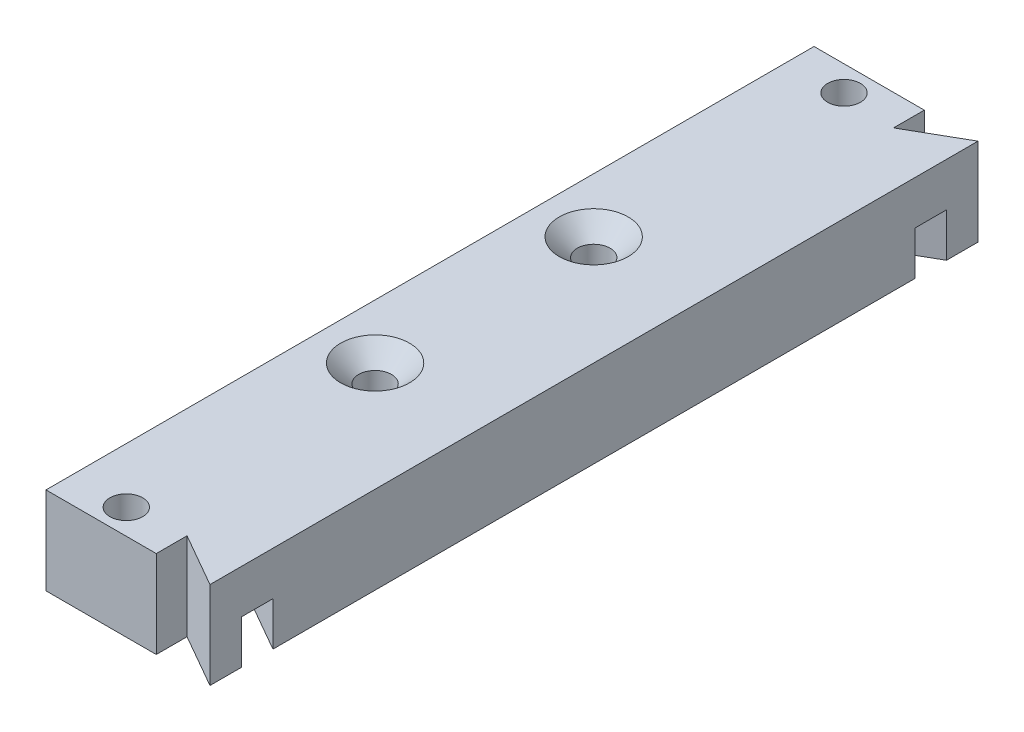
ISO-10303-21;
HEADER;
FILE_DESCRIPTION(('STEP AP214'),'2;1');
FILE_NAME('part.step','',(''),(''),'','','');
FILE_SCHEMA(('AUTOMOTIVE_DESIGN { 1 0 10303 214 1 1 1 1 }'));
ENDSEC;
DATA;
#1=APPLICATION_CONTEXT('core data for automotive mechanical design processes');
#2=APPLICATION_PROTOCOL_DEFINITION('international standard','automotive_design',2000,#1);
#3=PRODUCT_CONTEXT('',#1,'mechanical');
#4=PRODUCT('Part','Part','',(#3));
#5=PRODUCT_RELATED_PRODUCT_CATEGORY('part','',(#4));
#6=PRODUCT_DEFINITION_FORMATION('','',#4);
#7=PRODUCT_DEFINITION_CONTEXT('part definition',#1,'design');
#8=PRODUCT_DEFINITION('design','',#6,#7);
#9=PRODUCT_DEFINITION_SHAPE('','',#8);
#10=(LENGTH_UNIT() NAMED_UNIT(*) SI_UNIT(.MILLI.,.METRE.));
#11=(NAMED_UNIT(*) PLANE_ANGLE_UNIT() SI_UNIT($,.RADIAN.));
#12=(NAMED_UNIT(*) SI_UNIT($,.STERADIAN.) SOLID_ANGLE_UNIT());
#13=UNCERTAINTY_MEASURE_WITH_UNIT(LENGTH_MEASURE(1.E-05),#10,'distance_accuracy_value','');
#14=(GEOMETRIC_REPRESENTATION_CONTEXT(3) GLOBAL_UNCERTAINTY_ASSIGNED_CONTEXT((#13)) GLOBAL_UNIT_ASSIGNED_CONTEXT((#10,
#11,#12)) REPRESENTATION_CONTEXT('',''));
#15=CARTESIAN_POINT('',(0.,0.,0.));
#16=DIRECTION('',(0.,0.,1.));
#17=DIRECTION('',(1.,0.,0.));
#18=AXIS2_PLACEMENT_3D('',#15,#16,#17);
#19=CARTESIAN_POINT('',(0.,8.,0.));
#20=DIRECTION('',(0.,1.,0.));
#21=DIRECTION('',(0.,0.,1.));
#22=AXIS2_PLACEMENT_3D('',#19,#20,#21);
#23=PLANE('',#22);
#24=CARTESIAN_POINT('',(-2.45640421231828,8.,32.8312620118089));
#25=DIRECTION('',(0.,1.,0.));
#26=DIRECTION('',(0.,0.,1.));
#27=AXIS2_PLACEMENT_3D('',#24,#25,#26);
#28=CIRCLE('',#27,1.49999999999999);
#29=CARTESIAN_POINT('',(-2.45640421231828,8.,34.3312620118088));
#30=VERTEX_POINT('',#29);
#31=EDGE_CURVE('E207',#30,#30,#28,.F.);
#32=ORIENTED_EDGE('',*,*,#31,.T.);
#33=EDGE_LOOP('',(#32));
#34=FACE_BOUND('',#33,.T.);
#35=DIRECTION('',(-0.867610112365973,0.,0.497245103465387));
#36=VECTOR('',#35,1.);
#37=CARTESIAN_POINT('',(6.25688724133653,8.,-34.4188086603662));
#38=LINE('',#37,#36);
#39=CARTESIAN_POINT('',(7.5,8.,-35.1312620118089));
#40=VERTEX_POINT('',#39);
#41=CARTESIAN_POINT('',(2.58719157536374,8.,-32.3156310059045));
#42=VERTEX_POINT('',#41);
#43=EDGE_CURVE('E243',#40,#42,#38,.T.);
#44=ORIENTED_EDGE('',*,*,#43,.T.);
#45=DIRECTION('',(0.,0.,-1.));
#46=VECTOR('',#45,1.);
#47=CARTESIAN_POINT('',(2.58719157536374,8.,-29.5));
#48=LINE('',#47,#46);
#49=CARTESIAN_POINT('',(2.58719157536374,8.,-35.1312620118089));
#50=VERTEX_POINT('',#49);
#51=EDGE_CURVE('E210',#42,#50,#48,.T.);
#52=ORIENTED_EDGE('',*,*,#51,.T.);
#53=DIRECTION('',(-1.,0.,0.));
#54=VECTOR('',#53,1.);
#55=CARTESIAN_POINT('',(-7.49999999999998,8.,-35.1312620118089));
#56=LINE('',#55,#54);
#57=CARTESIAN_POINT('',(-7.49999999999998,8.,-35.1312620118089));
#58=VERTEX_POINT('',#57);
#59=EDGE_CURVE('E222',#50,#58,#56,.T.);
#60=ORIENTED_EDGE('',*,*,#59,.T.);
#61=DIRECTION('',(0.,0.,1.));
#62=VECTOR('',#61,1.);
#63=CARTESIAN_POINT('',(-7.5,8.,-24.5));
#64=LINE('',#63,#62);
#65=CARTESIAN_POINT('',(-7.5,8.,35.1312620118089));
#66=VERTEX_POINT('',#65);
#67=EDGE_CURVE('E354',#58,#66,#64,.T.);
#68=ORIENTED_EDGE('',*,*,#67,.T.);
#69=DIRECTION('',(1.,0.,0.));
#70=VECTOR('',#69,1.);
#71=CARTESIAN_POINT('',(-7.5,8.,35.1312620118089));
#72=LINE('',#71,#70);
#73=CARTESIAN_POINT('',(2.58719157536372,8.,35.1312620118089));
#74=VERTEX_POINT('',#73);
#75=EDGE_CURVE('E194',#66,#74,#72,.T.);
#76=ORIENTED_EDGE('',*,*,#75,.T.);
#77=DIRECTION('',(0.,0.,-1.));
#78=VECTOR('',#77,1.);
#79=CARTESIAN_POINT('',(2.58719157536372,8.,29.5));
#80=LINE('',#79,#78);
#81=CARTESIAN_POINT('',(2.58719157536372,8.,32.3156310059045));
#82=VERTEX_POINT('',#81);
#83=EDGE_CURVE('E201',#74,#82,#80,.T.);
#84=ORIENTED_EDGE('',*,*,#83,.T.);
#85=DIRECTION('',(0.867610112365975,0.,0.497245103465384));
#86=VECTOR('',#85,1.);
#87=CARTESIAN_POINT('',(7.5,8.,35.1312620118089));
#88=LINE('',#87,#86);
#89=CARTESIAN_POINT('',(7.5,8.,35.1312620118089));
#90=VERTEX_POINT('',#89);
#91=EDGE_CURVE('E54',#82,#90,#88,.T.);
#92=ORIENTED_EDGE('',*,*,#91,.T.);
#93=DIRECTION('',(0.,0.,-1.));
#94=VECTOR('',#93,1.);
#95=CARTESIAN_POINT('',(7.5,8.,-24.5));
#96=LINE('',#95,#94);
#97=EDGE_CURVE('E352',#90,#40,#96,.T.);
#98=ORIENTED_EDGE('',*,*,#97,.T.);
#99=EDGE_LOOP('',(#44,#52,#60,#68,#76,#84,#92,#98));
#100=FACE_BOUND('',#99,.T.);
#101=CARTESIAN_POINT('',(-2.49999991059316,8.,10.0249999999876));
#102=DIRECTION('',(0.,1.,0.));
#103=DIRECTION('',(0.,0.,1.));
#104=AXIS2_PLACEMENT_3D('',#101,#102,#103);
#105=CIRCLE('',#104,3.15);
#106=CARTESIAN_POINT('',(-2.49999991059316,8.,13.1749999999876));
#107=VERTEX_POINT('',#106);
#108=EDGE_CURVE('E324',#107,#107,#105,.T.);
#109=ORIENTED_EDGE('',*,*,#108,.F.);
#110=EDGE_LOOP('',(#109));
#111=FACE_BOUND('',#110,.T.);
#112=CARTESIAN_POINT('',(-2.49999991059317,8.,-9.97500000001244));
#113=DIRECTION('',(0.,1.,0.));
#114=DIRECTION('',(0.,0.,1.));
#115=AXIS2_PLACEMENT_3D('',#112,#113,#114);
#116=CIRCLE('',#115,3.15);
#117=CARTESIAN_POINT('',(-2.49999991059317,8.,-6.82500000001244));
#118=VERTEX_POINT('',#117);
#119=EDGE_CURVE('E342',#118,#118,#116,.T.);
#120=ORIENTED_EDGE('',*,*,#119,.F.);
#121=EDGE_LOOP('',(#120));
#122=FACE_BOUND('',#121,.T.);
#123=CARTESIAN_POINT('',(-2.45640421231828,8.,-32.8312620118089));
#124=DIRECTION('',(0.,1.,0.));
#125=DIRECTION('',(0.,0.,1.));
#126=AXIS2_PLACEMENT_3D('',#123,#124,#125);
#127=CIRCLE('',#126,1.49999999999999);
#128=CARTESIAN_POINT('',(-2.45640421231828,8.,-31.3312620118089));
#129=VERTEX_POINT('',#128);
#130=EDGE_CURVE('E489',#129,#129,#127,.T.);
#131=ORIENTED_EDGE('',*,*,#130,.F.);
#132=EDGE_LOOP('',(#131));
#133=FACE_BOUND('',#132,.T.);
#134=ADVANCED_FACE('F39',(#34,#100,#111,#122,#133),#23,.T.);
#135=CARTESIAN_POINT('',(-7.5,8.,-24.5));
#136=DIRECTION('',(0.,0.,1.));
#137=DIRECTION('',(1.,0.,0.));
#138=AXIS2_PLACEMENT_3D('',#135,#136,#137);
#139=PLANE('',#138);
#140=DIRECTION('',(1.,0.,0.));
#141=VECTOR('',#140,1.);
#142=CARTESIAN_POINT('',(-0.994383150726536,4.,-24.5));
#143=LINE('',#142,#141);
#144=CARTESIAN_POINT('',(-7.5,4.,-24.5));
#145=VERTEX_POINT('',#144);
#146=CARTESIAN_POINT('',(-0.994383150726536,4.,-24.5));
#147=VERTEX_POINT('',#146);
#148=EDGE_CURVE('E294',#145,#147,#143,.T.);
#149=ORIENTED_EDGE('',*,*,#148,.T.);
#150=DIRECTION('',(0.,1.,0.));
#151=VECTOR('',#150,1.);
#152=CARTESIAN_POINT('',(-0.994383150726536,0.,-24.5));
#153=LINE('',#152,#151);
#154=CARTESIAN_POINT('',(-0.994383150726536,0.,-24.5));
#155=VERTEX_POINT('',#154);
#156=EDGE_CURVE('E327',#155,#147,#153,.T.);
#157=ORIENTED_EDGE('',*,*,#156,.F.);
#158=DIRECTION('',(-1.,0.,0.));
#159=VECTOR('',#158,1.);
#160=CARTESIAN_POINT('',(-7.5,0.,-24.5));
#161=LINE('',#160,#159);
#162=CARTESIAN_POINT('',(-7.5,0.,-24.5));
#163=VERTEX_POINT('',#162);
#164=EDGE_CURVE('E358',#155,#163,#161,.T.);
#165=ORIENTED_EDGE('',*,*,#164,.T.);
#166=DIRECTION('',(0.,-1.,0.));
#167=VECTOR('',#166,1.);
#168=CARTESIAN_POINT('',(-7.5,8.,-24.5));
#169=LINE('',#168,#167);
#170=EDGE_CURVE('E11',#145,#163,#169,.T.);
#171=ORIENTED_EDGE('',*,*,#170,.F.);
#172=EDGE_LOOP('',(#149,#157,#165,#171));
#173=FACE_BOUND('',#172,.T.);
#174=ADVANCED_FACE('F433',(#173),#139,.F.);
#175=CARTESIAN_POINT('',(7.5,0.,-29.3683047470936));
#176=DIRECTION('',(-0.497245103465387,0.,-0.867610112365973));
#177=DIRECTION('',(-0.867610112365973,0.,0.497245103465387));
#178=AXIS2_PLACEMENT_3D('',#175,#176,#177);
#179=PLANE('',#178);
#180=ORIENTED_EDGE('',*,*,#156,.T.);
#181=DIRECTION('',(0.867610112365973,0.,-0.497245103465387));
#182=VECTOR('',#181,1.);
#183=CARTESIAN_POINT('',(7.5,4.,-29.3683047470936));
#184=LINE('',#183,#182);
#185=CARTESIAN_POINT('',(7.5,4.,-29.3683047470936));
#186=VERTEX_POINT('',#185);
#187=EDGE_CURVE('E297',#147,#186,#184,.T.);
#188=ORIENTED_EDGE('',*,*,#187,.T.);
#189=DIRECTION('',(0.,1.,0.));
#190=VECTOR('',#189,1.);
#191=CARTESIAN_POINT('',(7.5,0.,-29.3683047470936));
#192=LINE('',#191,#190);
#193=CARTESIAN_POINT('',(7.5,0.,-29.3683047470936));
#194=VERTEX_POINT('',#193);
#195=EDGE_CURVE('E300',#194,#186,#192,.T.);
#196=ORIENTED_EDGE('',*,*,#195,.F.);
#197=DIRECTION('',(-0.867610112365973,0.,0.497245103465387));
#198=VECTOR('',#197,1.);
#199=CARTESIAN_POINT('',(7.5,0.,-29.3683047470936));
#200=LINE('',#199,#198);
#201=EDGE_CURVE('E320',#194,#155,#200,.T.);
#202=ORIENTED_EDGE('',*,*,#201,.T.);
#203=EDGE_LOOP('',(#180,#188,#196,#202));
#204=FACE_BOUND('',#203,.T.);
#205=ADVANCED_FACE('F440',(#204),#179,.T.);
#206=CARTESIAN_POINT('',(7.5,8.,-24.5));
#207=DIRECTION('',(-1.,0.,0.));
#208=DIRECTION('',(0.,0.,1.));
#209=AXIS2_PLACEMENT_3D('',#206,#207,#208);
#210=PLANE('',#209);
#211=DIRECTION('',(0.,0.,-1.));
#212=VECTOR('',#211,1.);
#213=CARTESIAN_POINT('',(7.5,0.,-24.5));
#214=LINE('',#213,#212);
#215=CARTESIAN_POINT('',(7.5,0.,29.3683047470936));
#216=VERTEX_POINT('',#215);
#217=EDGE_CURVE('E351',#216,#194,#214,.T.);
#218=ORIENTED_EDGE('',*,*,#217,.T.);
#219=ORIENTED_EDGE('',*,*,#195,.T.);
#220=DIRECTION('',(0.,0.,-1.));
#221=VECTOR('',#220,1.);
#222=CARTESIAN_POINT('',(7.5,4.,-29.3683047470936));
#223=LINE('',#222,#221);
#224=CARTESIAN_POINT('',(7.5,4.,-32.2497833794513));
#225=VERTEX_POINT('',#224);
#226=EDGE_CURVE('E281',#186,#225,#223,.T.);
#227=ORIENTED_EDGE('',*,*,#226,.T.);
#228=DIRECTION('',(0.,1.,0.));
#229=VECTOR('',#228,1.);
#230=CARTESIAN_POINT('',(7.5,0.,-32.2497833794513));
#231=LINE('',#230,#229);
#232=CARTESIAN_POINT('',(7.5,0.,-32.2497833794513));
#233=VERTEX_POINT('',#232);
#234=EDGE_CURVE('E233',#233,#225,#231,.T.);
#235=ORIENTED_EDGE('',*,*,#234,.F.);
#236=DIRECTION('',(0.,0.,-1.));
#237=VECTOR('',#236,1.);
#238=CARTESIAN_POINT('',(7.5,0.,-32.2497833794513));
#239=LINE('',#238,#237);
#240=CARTESIAN_POINT('',(7.5,0.,-35.1312620118089));
#241=VERTEX_POINT('',#240);
#242=EDGE_CURVE('E268',#233,#241,#239,.T.);
#243=ORIENTED_EDGE('',*,*,#242,.T.);
#244=DIRECTION('',(0.,1.,0.));
#245=VECTOR('',#244,1.);
#246=CARTESIAN_POINT('',(7.5,0.,-35.1312620118089));
#247=LINE('',#246,#245);
#248=EDGE_CURVE('E254',#241,#40,#247,.T.);
#249=ORIENTED_EDGE('',*,*,#248,.T.);
#250=ORIENTED_EDGE('',*,*,#97,.F.);
#251=DIRECTION('',(0.,1.,0.));
#252=VECTOR('',#251,1.);
#253=CARTESIAN_POINT('',(7.5,0.,35.1312620118089));
#254=LINE('',#253,#252);
#255=CARTESIAN_POINT('',(7.5,0.,35.1312620118089));
#256=VERTEX_POINT('',#255);
#257=EDGE_CURVE('E251',#256,#90,#254,.T.);
#258=ORIENTED_EDGE('',*,*,#257,.F.);
#259=DIRECTION('',(0.,0.,-1.));
#260=VECTOR('',#259,1.);
#261=CARTESIAN_POINT('',(7.5,0.,32.2497833794513));
#262=LINE('',#261,#260);
#263=CARTESIAN_POINT('',(7.5,0.,32.2497833794513));
#264=VERTEX_POINT('',#263);
#265=EDGE_CURVE('E236',#256,#264,#262,.T.);
#266=ORIENTED_EDGE('',*,*,#265,.T.);
#267=DIRECTION('',(0.,1.,0.));
#268=VECTOR('',#267,1.);
#269=CARTESIAN_POINT('',(7.5,0.,32.2497833794513));
#270=LINE('',#269,#268);
#271=CARTESIAN_POINT('',(7.5,4.,32.2497833794513));
#272=VERTEX_POINT('',#271);
#273=EDGE_CURVE('E248',#264,#272,#270,.T.);
#274=ORIENTED_EDGE('',*,*,#273,.T.);
#275=DIRECTION('',(0.,0.,-1.));
#276=VECTOR('',#275,1.);
#277=CARTESIAN_POINT('',(7.5,4.,29.3683047470936));
#278=LINE('',#277,#276);
#279=CARTESIAN_POINT('',(7.5,4.,29.3683047470936));
#280=VERTEX_POINT('',#279);
#281=EDGE_CURVE('E306',#272,#280,#278,.T.);
#282=ORIENTED_EDGE('',*,*,#281,.T.);
#283=DIRECTION('',(0.,1.,0.));
#284=VECTOR('',#283,1.);
#285=CARTESIAN_POINT('',(7.5,0.,29.3683047470936));
#286=LINE('',#285,#284);
#287=EDGE_CURVE('E321',#216,#280,#286,.T.);
#288=ORIENTED_EDGE('',*,*,#287,.F.);
#289=EDGE_LOOP('',(#218,#219,#227,#235,#243,#249,#250,#258,#266,#274,#282,#288));
#290=FACE_BOUND('',#289,.T.);
#291=ADVANCED_FACE('F41',(#290),#210,.F.);
#292=CARTESIAN_POINT('',(-7.5,8.,-24.5));
#293=DIRECTION('',(1.,0.,0.));
#294=DIRECTION('',(0.,0.,-1.));
#295=AXIS2_PLACEMENT_3D('',#292,#293,#294);
#296=PLANE('',#295);
#297=DIRECTION('',(0.,0.,1.));
#298=VECTOR('',#297,1.);
#299=CARTESIAN_POINT('',(-7.5,0.,-24.5));
#300=LINE('',#299,#298);
#301=CARTESIAN_POINT('',(-7.5,0.,24.5));
#302=VERTEX_POINT('',#301);
#303=EDGE_CURVE('E361',#163,#302,#300,.T.);
#304=ORIENTED_EDGE('',*,*,#303,.T.);
#305=DIRECTION('',(0.,-1.,0.));
#306=VECTOR('',#305,1.);
#307=CARTESIAN_POINT('',(-7.5,8.,24.5));
#308=LINE('',#307,#306);
#309=CARTESIAN_POINT('',(-7.5,4.,24.5));
#310=VERTEX_POINT('',#309);
#311=EDGE_CURVE('E47',#310,#302,#308,.T.);
#312=ORIENTED_EDGE('',*,*,#311,.F.);
#313=DIRECTION('',(0.,0.,1.));
#314=VECTOR('',#313,1.);
#315=CARTESIAN_POINT('',(-7.5,4.,27.));
#316=LINE('',#315,#314);
#317=CARTESIAN_POINT('',(-7.5,4.,27.));
#318=VERTEX_POINT('',#317);
#319=EDGE_CURVE('E285',#310,#318,#316,.T.);
#320=ORIENTED_EDGE('',*,*,#319,.T.);
#321=DIRECTION('',(0.,1.,0.));
#322=VECTOR('',#321,1.);
#323=CARTESIAN_POINT('',(-7.5,0.,27.));
#324=LINE('',#323,#322);
#325=CARTESIAN_POINT('',(-7.5,0.,27.));
#326=VERTEX_POINT('',#325);
#327=EDGE_CURVE('E181',#326,#318,#324,.T.);
#328=ORIENTED_EDGE('',*,*,#327,.F.);
#329=DIRECTION('',(0.,0.,1.));
#330=VECTOR('',#329,1.);
#331=CARTESIAN_POINT('',(-7.5,0.,27.));
#332=LINE('',#331,#330);
#333=CARTESIAN_POINT('',(-7.5,0.,35.1312620118089));
#334=VERTEX_POINT('',#333);
#335=EDGE_CURVE('E173',#326,#334,#332,.T.);
#336=ORIENTED_EDGE('',*,*,#335,.T.);
#337=DIRECTION('',(0.,1.,0.));
#338=VECTOR('',#337,1.);
#339=CARTESIAN_POINT('',(-7.5,0.,35.1312620118089));
#340=LINE('',#339,#338);
#341=EDGE_CURVE('E177',#334,#66,#340,.T.);
#342=ORIENTED_EDGE('',*,*,#341,.T.);
#343=ORIENTED_EDGE('',*,*,#67,.F.);
#344=DIRECTION('',(0.,1.,0.));
#345=VECTOR('',#344,1.);
#346=CARTESIAN_POINT('',(-7.49999999999998,0.,-35.1312620118089));
#347=LINE('',#346,#345);
#348=CARTESIAN_POINT('',(-7.49999999999998,0.,-35.1312620118089));
#349=VERTEX_POINT('',#348);
#350=EDGE_CURVE('E218',#349,#58,#347,.T.);
#351=ORIENTED_EDGE('',*,*,#350,.F.);
#352=DIRECTION('',(0.,0.,1.));
#353=VECTOR('',#352,1.);
#354=CARTESIAN_POINT('',(-7.5,0.,-29.5));
#355=LINE('',#354,#353);
#356=CARTESIAN_POINT('',(-7.5,0.,-27.));
#357=VERTEX_POINT('',#356);
#358=EDGE_CURVE('E274',#349,#357,#355,.T.);
#359=ORIENTED_EDGE('',*,*,#358,.T.);
#360=DIRECTION('',(0.,1.,0.));
#361=VECTOR('',#360,1.);
#362=CARTESIAN_POINT('',(-7.5,0.,-27.));
#363=LINE('',#362,#361);
#364=CARTESIAN_POINT('',(-7.5,4.,-27.));
#365=VERTEX_POINT('',#364);
#366=EDGE_CURVE('E258',#357,#365,#363,.T.);
#367=ORIENTED_EDGE('',*,*,#366,.T.);
#368=DIRECTION('',(0.,0.,1.));
#369=VECTOR('',#368,1.);
#370=CARTESIAN_POINT('',(-7.5,4.,-24.5));
#371=LINE('',#370,#369);
#372=EDGE_CURVE('E291',#365,#145,#371,.T.);
#373=ORIENTED_EDGE('',*,*,#372,.T.);
#374=ORIENTED_EDGE('',*,*,#170,.T.);
#375=EDGE_LOOP('',(#304,#312,#320,#328,#336,#342,#343,#351,#359,#367,#373,#374));
#376=FACE_BOUND('',#375,.T.);
#377=ADVANCED_FACE('F176',(#376),#296,.F.);
#378=CARTESIAN_POINT('',(-7.5,8.,24.5));
#379=DIRECTION('',(0.,0.,-1.));
#380=DIRECTION('',(-1.,0.,0.));
#381=AXIS2_PLACEMENT_3D('',#378,#379,#380);
#382=PLANE('',#381);
#383=DIRECTION('',(0.,1.,0.));
#384=VECTOR('',#383,1.);
#385=CARTESIAN_POINT('',(-0.994383150726525,0.,24.5));
#386=LINE('',#385,#384);
#387=CARTESIAN_POINT('',(-0.994383150726525,0.,24.5));
#388=VERTEX_POINT('',#387);
#389=CARTESIAN_POINT('',(-0.994383150726525,4.,24.5));
#390=VERTEX_POINT('',#389);
#391=EDGE_CURVE('E319',#388,#390,#386,.T.);
#392=ORIENTED_EDGE('',*,*,#391,.T.);
#393=DIRECTION('',(-1.,0.,0.));
#394=VECTOR('',#393,1.);
#395=CARTESIAN_POINT('',(-7.5,4.,24.5));
#396=LINE('',#395,#394);
#397=EDGE_CURVE('E247',#390,#310,#396,.T.);
#398=ORIENTED_EDGE('',*,*,#397,.T.);
#399=ORIENTED_EDGE('',*,*,#311,.T.);
#400=DIRECTION('',(1.,0.,0.));
#401=VECTOR('',#400,1.);
#402=CARTESIAN_POINT('',(-7.5,0.,24.5));
#403=LINE('',#402,#401);
#404=EDGE_CURVE('E355',#302,#388,#403,.T.);
#405=ORIENTED_EDGE('',*,*,#404,.T.);
#406=EDGE_LOOP('',(#392,#398,#399,#405));
#407=FACE_BOUND('',#406,.T.);
#408=ADVANCED_FACE('F366',(#407),#382,.F.);
#409=CARTESIAN_POINT('',(0.,0.,0.));
#410=DIRECTION('',(0.,1.,0.));
#411=DIRECTION('',(0.,0.,1.));
#412=AXIS2_PLACEMENT_3D('',#409,#410,#411);
#413=PLANE('',#412);
#414=CARTESIAN_POINT('',(-2.49999991059316,0.,10.0249999999876));
#415=DIRECTION('',(0.,1.,0.));
#416=DIRECTION('',(0.,0.,1.));
#417=AXIS2_PLACEMENT_3D('',#414,#415,#416);
#418=CIRCLE('',#417,1.5);
#419=CARTESIAN_POINT('',(-2.49999991059316,0.,11.5249999999876));
#420=VERTEX_POINT('',#419);
#421=EDGE_CURVE('E339',#420,#420,#418,.T.);
#422=ORIENTED_EDGE('',*,*,#421,.T.);
#423=EDGE_LOOP('',(#422));
#424=FACE_BOUND('',#423,.T.);
#425=CARTESIAN_POINT('',(-2.49999991059317,0.,-9.97500000001244));
#426=DIRECTION('',(0.,1.,0.));
#427=DIRECTION('',(0.,0.,1.));
#428=AXIS2_PLACEMENT_3D('',#425,#426,#427);
#429=CIRCLE('',#428,1.5);
#430=CARTESIAN_POINT('',(-2.49999991059317,0.,-8.47500000001245));
#431=VERTEX_POINT('',#430);
#432=EDGE_CURVE('E348',#431,#431,#429,.T.);
#433=ORIENTED_EDGE('',*,*,#432,.T.);
#434=EDGE_LOOP('',(#433));
#435=FACE_BOUND('',#434,.T.);
#436=ORIENTED_EDGE('',*,*,#217,.F.);
#437=DIRECTION('',(0.867610112365973,0.,0.497245103465387));
#438=VECTOR('',#437,1.);
#439=CARTESIAN_POINT('',(-0.994383150726525,0.,24.5));
#440=LINE('',#439,#438);
#441=EDGE_CURVE('E316',#388,#216,#440,.T.);
#442=ORIENTED_EDGE('',*,*,#441,.F.);
#443=ORIENTED_EDGE('',*,*,#404,.F.);
#444=ORIENTED_EDGE('',*,*,#303,.F.);
#445=ORIENTED_EDGE('',*,*,#164,.F.);
#446=ORIENTED_EDGE('',*,*,#201,.F.);
#447=EDGE_LOOP('',(#436,#442,#443,#444,#445,#446));
#448=FACE_BOUND('',#447,.T.);
#449=ADVANCED_FACE('F373',(#424,#435,#448),#413,.F.);
#450=CARTESIAN_POINT('',(-2.49999991059317,8.,-9.97500000001244));
#451=DIRECTION('',(0.,1.,0.));
#452=DIRECTION('',(0.,0.,1.));
#453=AXIS2_PLACEMENT_3D('',#450,#451,#452);
#454=CYLINDRICAL_SURFACE('',#453,1.5);
#455=ORIENTED_EDGE('',*,*,#432,.F.);
#456=EDGE_LOOP('',(#455));
#457=FACE_BOUND('',#456,.T.);
#458=CARTESIAN_POINT('',(-2.49999991059317,6.35,-9.97500000001244));
#459=DIRECTION('',(0.,1.,0.));
#460=DIRECTION('',(0.,0.,1.));
#461=AXIS2_PLACEMENT_3D('',#458,#459,#460);
#462=CIRCLE('',#461,1.5);
#463=CARTESIAN_POINT('',(-2.49999991059317,6.35,-8.47500000001245));
#464=VERTEX_POINT('',#463);
#465=EDGE_CURVE('E345',#464,#464,#462,.T.);
#466=ORIENTED_EDGE('',*,*,#465,.T.);
#467=EDGE_LOOP('',(#466));
#468=FACE_BOUND('',#467,.T.);
#469=ADVANCED_FACE('F445',(#457,#468),#454,.F.);
#470=CARTESIAN_POINT('',(-2.49999991059317,8.,-9.97500000001244));
#471=DIRECTION('',(0.,1.,0.));
#472=DIRECTION('',(0.,0.,1.));
#473=AXIS2_PLACEMENT_3D('',#470,#471,#472);
#474=CONICAL_SURFACE('',#473,3.15,0.785398163397449);
#475=ORIENTED_EDGE('',*,*,#465,.F.);
#476=EDGE_LOOP('',(#475));
#477=FACE_BOUND('',#476,.T.);
#478=ORIENTED_EDGE('',*,*,#119,.T.);
#479=EDGE_LOOP('',(#478));
#480=FACE_BOUND('',#479,.T.);
#481=ADVANCED_FACE('F474',(#477,#480),#474,.F.);
#482=CARTESIAN_POINT('',(-2.49999991059316,8.,10.0249999999876));
#483=DIRECTION('',(0.,1.,0.));
#484=DIRECTION('',(0.,0.,1.));
#485=AXIS2_PLACEMENT_3D('',#482,#483,#484);
#486=CYLINDRICAL_SURFACE('',#485,1.5);
#487=ORIENTED_EDGE('',*,*,#421,.F.);
#488=EDGE_LOOP('',(#487));
#489=FACE_BOUND('',#488,.T.);
#490=CARTESIAN_POINT('',(-2.49999991059316,6.35,10.0249999999876));
#491=DIRECTION('',(0.,1.,0.));
#492=DIRECTION('',(0.,0.,1.));
#493=AXIS2_PLACEMENT_3D('',#490,#491,#492);
#494=CIRCLE('',#493,1.5);
#495=CARTESIAN_POINT('',(-2.49999991059316,6.35,11.5249999999876));
#496=VERTEX_POINT('',#495);
#497=EDGE_CURVE('E336',#496,#496,#494,.T.);
#498=ORIENTED_EDGE('',*,*,#497,.T.);
#499=EDGE_LOOP('',(#498));
#500=FACE_BOUND('',#499,.T.);
#501=ADVANCED_FACE('F471',(#489,#500),#486,.F.);
#502=CARTESIAN_POINT('',(-2.49999991059316,8.,10.0249999999876));
#503=DIRECTION('',(0.,1.,0.));
#504=DIRECTION('',(0.,0.,1.));
#505=AXIS2_PLACEMENT_3D('',#502,#503,#504);
#506=CONICAL_SURFACE('',#505,3.15,0.785398163397449);
#507=ORIENTED_EDGE('',*,*,#497,.F.);
#508=EDGE_LOOP('',(#507));
#509=FACE_BOUND('',#508,.T.);
#510=ORIENTED_EDGE('',*,*,#108,.T.);
#511=EDGE_LOOP('',(#510));
#512=FACE_BOUND('',#511,.T.);
#513=ADVANCED_FACE('F468',(#509,#512),#506,.F.);
#514=CARTESIAN_POINT('',(-0.994383150726525,0.,24.5));
#515=DIRECTION('',(-0.497245103465387,0.,0.867610112365973));
#516=DIRECTION('',(0.867610112365973,0.,0.497245103465387));
#517=AXIS2_PLACEMENT_3D('',#514,#515,#516);
#518=PLANE('',#517);
#519=DIRECTION('',(-0.867610112365973,0.,-0.497245103465387));
#520=VECTOR('',#519,1.);
#521=CARTESIAN_POINT('',(-0.994383150726525,4.,24.5));
#522=LINE('',#521,#520);
#523=EDGE_CURVE('E303',#280,#390,#522,.T.);
#524=ORIENTED_EDGE('',*,*,#523,.T.);
#525=ORIENTED_EDGE('',*,*,#391,.F.);
#526=ORIENTED_EDGE('',*,*,#441,.T.);
#527=ORIENTED_EDGE('',*,*,#287,.T.);
#528=EDGE_LOOP('',(#524,#525,#526,#527));
#529=FACE_BOUND('',#528,.T.);
#530=ADVANCED_FACE('F377',(#529),#518,.T.);
#531=CARTESIAN_POINT('',(0.,4.,0.));
#532=DIRECTION('',(0.,1.,0.));
#533=DIRECTION('',(0.,0.,1.));
#534=AXIS2_PLACEMENT_3D('',#531,#532,#533);
#535=PLANE('',#534);
#536=ORIENTED_EDGE('',*,*,#226,.F.);
#537=ORIENTED_EDGE('',*,*,#187,.F.);
#538=ORIENTED_EDGE('',*,*,#148,.F.);
#539=ORIENTED_EDGE('',*,*,#372,.F.);
#540=DIRECTION('',(-1.,0.,0.));
#541=VECTOR('',#540,1.);
#542=CARTESIAN_POINT('',(-1.65999999999956,4.,-27.));
#543=LINE('',#542,#541);
#544=CARTESIAN_POINT('',(-1.65999999999956,4.,-27.));
#545=VERTEX_POINT('',#544);
#546=EDGE_CURVE('E288',#545,#365,#543,.T.);
#547=ORIENTED_EDGE('',*,*,#546,.F.);
#548=DIRECTION('',(-0.867610112365972,0.,0.497245103465388));
#549=VECTOR('',#548,1.);
#550=CARTESIAN_POINT('',(7.5,4.,-32.2497833794513));
#551=LINE('',#550,#549);
#552=EDGE_CURVE('E284',#225,#545,#551,.T.);
#553=ORIENTED_EDGE('',*,*,#552,.F.);
#554=EDGE_LOOP('',(#536,#537,#538,#539,#547,#553));
#555=FACE_BOUND('',#554,.T.);
#556=ADVANCED_FACE('F408',(#555),#535,.F.);
#557=CARTESIAN_POINT('',(0.,4.,0.));
#558=DIRECTION('',(0.,-1.,0.));
#559=DIRECTION('',(0.,0.,-1.));
#560=AXIS2_PLACEMENT_3D('',#557,#558,#559);
#561=PLANE('',#560);
#562=ORIENTED_EDGE('',*,*,#319,.F.);
#563=ORIENTED_EDGE('',*,*,#397,.F.);
#564=ORIENTED_EDGE('',*,*,#523,.F.);
#565=ORIENTED_EDGE('',*,*,#281,.F.);
#566=DIRECTION('',(0.867610112365973,0.,0.497245103465387));
#567=VECTOR('',#566,1.);
#568=CARTESIAN_POINT('',(-1.65999999999954,4.,27.));
#569=LINE('',#568,#567);
#570=CARTESIAN_POINT('',(-1.65999999999954,4.,27.));
#571=VERTEX_POINT('',#570);
#572=EDGE_CURVE('E309',#571,#272,#569,.T.);
#573=ORIENTED_EDGE('',*,*,#572,.F.);
#574=DIRECTION('',(1.,0.,0.));
#575=VECTOR('',#574,1.);
#576=CARTESIAN_POINT('',(-7.5,4.,27.));
#577=LINE('',#576,#575);
#578=EDGE_CURVE('E312',#318,#571,#577,.T.);
#579=ORIENTED_EDGE('',*,*,#578,.F.);
#580=EDGE_LOOP('',(#562,#563,#564,#565,#573,#579));
#581=FACE_BOUND('',#580,.T.);
#582=ADVANCED_FACE('F379',(#581),#561,.T.);
#583=CARTESIAN_POINT('',(-7.5,0.,27.));
#584=DIRECTION('',(0.,0.,-1.));
#585=DIRECTION('',(-1.,0.,0.));
#586=AXIS2_PLACEMENT_3D('',#583,#584,#585);
#587=PLANE('',#586);
#588=ORIENTED_EDGE('',*,*,#327,.T.);
#589=ORIENTED_EDGE('',*,*,#578,.T.);
#590=DIRECTION('',(0.,1.,0.));
#591=VECTOR('',#590,1.);
#592=CARTESIAN_POINT('',(-1.65999999999954,0.,27.));
#593=LINE('',#592,#591);
#594=CARTESIAN_POINT('',(-1.65999999999954,0.,27.));
#595=VERTEX_POINT('',#594);
#596=EDGE_CURVE('E244',#595,#571,#593,.T.);
#597=ORIENTED_EDGE('',*,*,#596,.F.);
#598=DIRECTION('',(-1.,0.,0.));
#599=VECTOR('',#598,1.);
#600=CARTESIAN_POINT('',(-7.5,0.,27.));
#601=LINE('',#600,#599);
#602=EDGE_CURVE('E187',#595,#326,#601,.T.);
#603=ORIENTED_EDGE('',*,*,#602,.T.);
#604=EDGE_LOOP('',(#588,#589,#597,#603));
#605=FACE_BOUND('',#604,.T.);
#606=ADVANCED_FACE('F387',(#605),#587,.T.);
#607=CARTESIAN_POINT('',(-1.65999999999954,0.,27.));
#608=DIRECTION('',(0.497245103465387,0.,-0.867610112365973));
#609=DIRECTION('',(-0.867610112365973,0.,-0.497245103465387));
#610=AXIS2_PLACEMENT_3D('',#607,#608,#609);
#611=PLANE('',#610);
#612=ORIENTED_EDGE('',*,*,#596,.T.);
#613=ORIENTED_EDGE('',*,*,#572,.T.);
#614=ORIENTED_EDGE('',*,*,#273,.F.);
#615=DIRECTION('',(-0.867610112365973,0.,-0.497245103465387));
#616=VECTOR('',#615,1.);
#617=CARTESIAN_POINT('',(-1.65999999999954,0.,27.));
#618=LINE('',#617,#616);
#619=EDGE_CURVE('E239',#264,#595,#618,.T.);
#620=ORIENTED_EDGE('',*,*,#619,.T.);
#621=EDGE_LOOP('',(#612,#613,#614,#620));
#622=FACE_BOUND('',#621,.T.);
#623=ADVANCED_FACE('F385',(#622),#611,.T.);
#624=CARTESIAN_POINT('',(7.5,0.,35.1312620118089));
#625=DIRECTION('',(-0.497245103465384,0.,0.867610112365975));
#626=DIRECTION('',(0.867610112365975,0.,0.497245103465384));
#627=AXIS2_PLACEMENT_3D('',#624,#625,#626);
#628=PLANE('',#627);
#629=DIRECTION('',(0.,1.,0.));
#630=VECTOR('',#629,1.);
#631=CARTESIAN_POINT('',(2.58719157536372,0.,32.3156310059045));
#632=LINE('',#631,#630);
#633=CARTESIAN_POINT('',(2.58719157536372,0.,32.3156310059045));
#634=VERTEX_POINT('',#633);
#635=EDGE_CURVE('E58',#634,#82,#632,.T.);
#636=ORIENTED_EDGE('',*,*,#635,.F.);
#637=DIRECTION('',(0.867610112365973,0.,0.497245103465387));
#638=VECTOR('',#637,1.);
#639=CARTESIAN_POINT('',(-2.32561684927256,0.,29.5));
#640=LINE('',#639,#638);
#641=EDGE_CURVE('E186',#634,#256,#640,.T.);
#642=ORIENTED_EDGE('',*,*,#641,.T.);
#643=ORIENTED_EDGE('',*,*,#257,.T.);
#644=ORIENTED_EDGE('',*,*,#91,.F.);
#645=EDGE_LOOP('',(#636,#642,#643,#644));
#646=FACE_BOUND('',#645,.T.);
#647=ADVANCED_FACE('F419',(#646),#628,.T.);
#648=CARTESIAN_POINT('',(0.,0.,0.));
#649=DIRECTION('',(0.,-1.,0.));
#650=DIRECTION('',(0.,0.,-1.));
#651=AXIS2_PLACEMENT_3D('',#648,#649,#650);
#652=PLANE('',#651);
#653=CARTESIAN_POINT('',(-2.45640421231828,0.,32.8312620118089));
#654=DIRECTION('',(0.,1.,0.));
#655=DIRECTION('',(0.,0.,1.));
#656=AXIS2_PLACEMENT_3D('',#653,#654,#655);
#657=CIRCLE('',#656,1.49999999999999);
#658=CARTESIAN_POINT('',(-2.45640421231828,0.,34.3312620118088));
#659=VERTEX_POINT('',#658);
#660=EDGE_CURVE('E491',#659,#659,#657,.F.);
#661=ORIENTED_EDGE('',*,*,#660,.F.);
#662=EDGE_LOOP('',(#661));
#663=FACE_BOUND('',#662,.T.);
#664=ORIENTED_EDGE('',*,*,#641,.F.);
#665=DIRECTION('',(0.,0.,-1.));
#666=VECTOR('',#665,1.);
#667=CARTESIAN_POINT('',(2.58719157536372,0.,29.5));
#668=LINE('',#667,#666);
#669=CARTESIAN_POINT('',(2.58719157536372,0.,35.1312620118089));
#670=VERTEX_POINT('',#669);
#671=EDGE_CURVE('E196',#670,#634,#668,.T.);
#672=ORIENTED_EDGE('',*,*,#671,.F.);
#673=DIRECTION('',(1.,0.,0.));
#674=VECTOR('',#673,1.);
#675=CARTESIAN_POINT('',(-7.5,0.,35.1312620118089));
#676=LINE('',#675,#674);
#677=EDGE_CURVE('E192',#334,#670,#676,.T.);
#678=ORIENTED_EDGE('',*,*,#677,.F.);
#679=ORIENTED_EDGE('',*,*,#335,.F.);
#680=ORIENTED_EDGE('',*,*,#602,.F.);
#681=ORIENTED_EDGE('',*,*,#619,.F.);
#682=ORIENTED_EDGE('',*,*,#265,.F.);
#683=EDGE_LOOP('',(#664,#672,#678,#679,#680,#681,#682));
#684=FACE_BOUND('',#683,.T.);
#685=ADVANCED_FACE('F199',(#663,#684),#652,.T.);
#686=CARTESIAN_POINT('',(7.5,0.,-32.2497833794513));
#687=DIRECTION('',(0.497245103465387,0.,0.867610112365973));
#688=DIRECTION('',(0.867610112365973,0.,-0.497245103465387));
#689=AXIS2_PLACEMENT_3D('',#686,#687,#688);
#690=PLANE('',#689);
#691=ORIENTED_EDGE('',*,*,#552,.T.);
#692=DIRECTION('',(0.,1.,0.));
#693=VECTOR('',#692,1.);
#694=CARTESIAN_POINT('',(-1.65999999999956,0.,-27.));
#695=LINE('',#694,#693);
#696=CARTESIAN_POINT('',(-1.65999999999956,0.,-27.));
#697=VERTEX_POINT('',#696);
#698=EDGE_CURVE('E261',#697,#545,#695,.T.);
#699=ORIENTED_EDGE('',*,*,#698,.F.);
#700=DIRECTION('',(0.867610112365973,0.,-0.497245103465387));
#701=VECTOR('',#700,1.);
#702=CARTESIAN_POINT('',(7.5,0.,-32.2497833794513));
#703=LINE('',#702,#701);
#704=EDGE_CURVE('E257',#697,#233,#703,.T.);
#705=ORIENTED_EDGE('',*,*,#704,.T.);
#706=ORIENTED_EDGE('',*,*,#234,.T.);
#707=EDGE_LOOP('',(#691,#699,#705,#706));
#708=FACE_BOUND('',#707,.T.);
#709=ADVANCED_FACE('F410',(#708),#690,.T.);
#710=CARTESIAN_POINT('',(-1.65999999999956,0.,-27.));
#711=DIRECTION('',(0.,0.,1.));
#712=DIRECTION('',(1.,0.,0.));
#713=AXIS2_PLACEMENT_3D('',#710,#711,#712);
#714=PLANE('',#713);
#715=ORIENTED_EDGE('',*,*,#546,.T.);
#716=ORIENTED_EDGE('',*,*,#366,.F.);
#717=DIRECTION('',(1.,0.,0.));
#718=VECTOR('',#717,1.);
#719=CARTESIAN_POINT('',(-1.65999999999956,0.,-27.));
#720=LINE('',#719,#718);
#721=EDGE_CURVE('E271',#357,#697,#720,.T.);
#722=ORIENTED_EDGE('',*,*,#721,.T.);
#723=ORIENTED_EDGE('',*,*,#698,.T.);
#724=EDGE_LOOP('',(#715,#716,#722,#723));
#725=FACE_BOUND('',#724,.T.);
#726=ADVANCED_FACE('F406',(#725),#714,.T.);
#727=CARTESIAN_POINT('',(6.25688724133653,0.,-34.4188086603662));
#728=DIRECTION('',(-0.497245103465387,0.,-0.867610112365973));
#729=DIRECTION('',(-0.867610112365973,0.,0.497245103465387));
#730=AXIS2_PLACEMENT_3D('',#727,#728,#729);
#731=PLANE('',#730);
#732=DIRECTION('',(0.,-1.,0.));
#733=VECTOR('',#732,1.);
#734=CARTESIAN_POINT('',(2.58719157536374,0.,-32.3156310059045));
#735=LINE('',#734,#733);
#736=CARTESIAN_POINT('',(2.58719157536373,0.,-32.3156310059045));
#737=VERTEX_POINT('',#736);
#738=EDGE_CURVE('E212',#42,#737,#735,.T.);
#739=ORIENTED_EDGE('',*,*,#738,.F.);
#740=ORIENTED_EDGE('',*,*,#43,.F.);
#741=ORIENTED_EDGE('',*,*,#248,.F.);
#742=DIRECTION('',(-0.867610112365973,0.,0.497245103465388));
#743=VECTOR('',#742,1.);
#744=CARTESIAN_POINT('',(7.5,0.,-35.1312620118089));
#745=LINE('',#744,#743);
#746=EDGE_CURVE('E277',#241,#737,#745,.T.);
#747=ORIENTED_EDGE('',*,*,#746,.T.);
#748=EDGE_LOOP('',(#739,#740,#741,#747));
#749=FACE_BOUND('',#748,.T.);
#750=ADVANCED_FACE('F413',(#749),#731,.T.);
#751=CARTESIAN_POINT('',(0.,0.,0.));
#752=DIRECTION('',(0.,1.,0.));
#753=DIRECTION('',(0.,0.,1.));
#754=AXIS2_PLACEMENT_3D('',#751,#752,#753);
#755=PLANE('',#754);
#756=CARTESIAN_POINT('',(-2.45640421231828,0.,-32.8312620118089));
#757=DIRECTION('',(0.,1.,0.));
#758=DIRECTION('',(0.,0.,1.));
#759=AXIS2_PLACEMENT_3D('',#756,#757,#758);
#760=CIRCLE('',#759,1.49999999999999);
#761=CARTESIAN_POINT('',(-2.45640421231828,0.,-31.3312620118089));
#762=VERTEX_POINT('',#761);
#763=EDGE_CURVE('E221',#762,#762,#760,.T.);
#764=ORIENTED_EDGE('',*,*,#763,.T.);
#765=EDGE_LOOP('',(#764));
#766=FACE_BOUND('',#765,.T.);
#767=DIRECTION('',(0.,0.,-1.));
#768=VECTOR('',#767,1.);
#769=CARTESIAN_POINT('',(2.58719157536374,0.,-29.5));
#770=LINE('',#769,#768);
#771=CARTESIAN_POINT('',(2.58719157536374,0.,-35.1312620118089));
#772=VERTEX_POINT('',#771);
#773=EDGE_CURVE('E225',#737,#772,#770,.T.);
#774=ORIENTED_EDGE('',*,*,#773,.F.);
#775=ORIENTED_EDGE('',*,*,#746,.F.);
#776=ORIENTED_EDGE('',*,*,#242,.F.);
#777=ORIENTED_EDGE('',*,*,#704,.F.);
#778=ORIENTED_EDGE('',*,*,#721,.F.);
#779=ORIENTED_EDGE('',*,*,#358,.F.);
#780=DIRECTION('',(-1.,0.,0.));
#781=VECTOR('',#780,1.);
#782=CARTESIAN_POINT('',(-7.49999999999998,0.,-35.1312620118089));
#783=LINE('',#782,#781);
#784=EDGE_CURVE('E217',#772,#349,#783,.T.);
#785=ORIENTED_EDGE('',*,*,#784,.F.);
#786=EDGE_LOOP('',(#774,#775,#776,#777,#778,#779,#785));
#787=FACE_BOUND('',#786,.T.);
#788=ADVANCED_FACE('F401',(#766,#787),#755,.F.);
#789=CARTESIAN_POINT('',(-7.49999999999998,0.,-35.1312620118089));
#790=DIRECTION('',(0.,0.,-1.));
#791=DIRECTION('',(-1.,0.,0.));
#792=AXIS2_PLACEMENT_3D('',#789,#790,#791);
#793=PLANE('',#792);
#794=ORIENTED_EDGE('',*,*,#59,.F.);
#795=DIRECTION('',(0.,1.,0.));
#796=VECTOR('',#795,1.);
#797=CARTESIAN_POINT('',(2.58719157536374,0.,-35.1312620118089));
#798=LINE('',#797,#796);
#799=EDGE_CURVE('E214',#772,#50,#798,.T.);
#800=ORIENTED_EDGE('',*,*,#799,.F.);
#801=ORIENTED_EDGE('',*,*,#784,.T.);
#802=ORIENTED_EDGE('',*,*,#350,.T.);
#803=EDGE_LOOP('',(#794,#800,#801,#802));
#804=FACE_BOUND('',#803,.T.);
#805=ADVANCED_FACE('F396',(#804),#793,.T.);
#806=CARTESIAN_POINT('',(2.58719157536374,0.,-29.5));
#807=DIRECTION('',(1.,0.,0.));
#808=DIRECTION('',(0.,0.,-1.));
#809=AXIS2_PLACEMENT_3D('',#806,#807,#808);
#810=PLANE('',#809);
#811=ORIENTED_EDGE('',*,*,#51,.F.);
#812=ORIENTED_EDGE('',*,*,#738,.T.);
#813=ORIENTED_EDGE('',*,*,#773,.T.);
#814=ORIENTED_EDGE('',*,*,#799,.T.);
#815=EDGE_LOOP('',(#811,#812,#813,#814));
#816=FACE_BOUND('',#815,.T.);
#817=ADVANCED_FACE('F417',(#816),#810,.T.);
#818=CARTESIAN_POINT('',(2.58719157536372,0.,29.5));
#819=DIRECTION('',(1.,0.,0.));
#820=DIRECTION('',(0.,0.,-1.));
#821=AXIS2_PLACEMENT_3D('',#818,#819,#820);
#822=PLANE('',#821);
#823=ORIENTED_EDGE('',*,*,#671,.T.);
#824=ORIENTED_EDGE('',*,*,#635,.T.);
#825=ORIENTED_EDGE('',*,*,#83,.F.);
#826=DIRECTION('',(0.,1.,0.));
#827=VECTOR('',#826,1.);
#828=CARTESIAN_POINT('',(2.58719157536372,0.,35.1312620118089));
#829=LINE('',#828,#827);
#830=EDGE_CURVE('E195',#670,#74,#829,.T.);
#831=ORIENTED_EDGE('',*,*,#830,.F.);
#832=EDGE_LOOP('',(#823,#824,#825,#831));
#833=FACE_BOUND('',#832,.T.);
#834=ADVANCED_FACE('F389',(#833),#822,.T.);
#835=CARTESIAN_POINT('',(-7.5,0.,35.1312620118089));
#836=DIRECTION('',(0.,0.,1.));
#837=DIRECTION('',(1.,0.,0.));
#838=AXIS2_PLACEMENT_3D('',#835,#836,#837);
#839=PLANE('',#838);
#840=ORIENTED_EDGE('',*,*,#75,.F.);
#841=ORIENTED_EDGE('',*,*,#341,.F.);
#842=ORIENTED_EDGE('',*,*,#677,.T.);
#843=ORIENTED_EDGE('',*,*,#830,.T.);
#844=EDGE_LOOP('',(#840,#841,#842,#843));
#845=FACE_BOUND('',#844,.T.);
#846=ADVANCED_FACE('F191',(#845),#839,.T.);
#847=CARTESIAN_POINT('',(-2.45640421231828,0.,-32.8312620118089));
#848=DIRECTION('',(0.,1.,0.));
#849=DIRECTION('',(0.,0.,1.));
#850=AXIS2_PLACEMENT_3D('',#847,#848,#849);
#851=CYLINDRICAL_SURFACE('',#850,1.49999999999999);
#852=ORIENTED_EDGE('',*,*,#763,.F.);
#853=EDGE_LOOP('',(#852));
#854=FACE_BOUND('',#853,.T.);
#855=ORIENTED_EDGE('',*,*,#130,.T.);
#856=EDGE_LOOP('',(#855));
#857=FACE_BOUND('',#856,.T.);
#858=ADVANCED_FACE('F502',(#854,#857),#851,.F.);
#859=CARTESIAN_POINT('',(-2.45640421231828,0.,32.8312620118089));
#860=DIRECTION('',(0.,1.,0.));
#861=DIRECTION('',(0.,0.,1.));
#862=AXIS2_PLACEMENT_3D('',#859,#860,#861);
#863=CYLINDRICAL_SURFACE('',#862,1.49999999999999);
#864=ORIENTED_EDGE('',*,*,#660,.T.);
#865=EDGE_LOOP('',(#864));
#866=FACE_BOUND('',#865,.T.);
#867=ORIENTED_EDGE('',*,*,#31,.F.);
#868=EDGE_LOOP('',(#867));
#869=FACE_BOUND('',#868,.T.);
#870=ADVANCED_FACE('F500',(#866,#869),#863,.F.);
#871=CLOSED_SHELL('',(#134,#174,#205,#291,#377,#408,#449,#469,#481,#501,#513,#530,#556,#582,
#606,#623,#647,#685,#709,#726,#750,#788,#805,#817,#834,#846,#858,#870));
#872=MANIFOLD_SOLID_BREP('B2',#871);
#873=ADVANCED_BREP_SHAPE_REPRESENTATION('',(#18,#872),#14);
#874=SHAPE_DEFINITION_REPRESENTATION(#9,#873);
ENDSEC;
END-ISO-10303-21;
